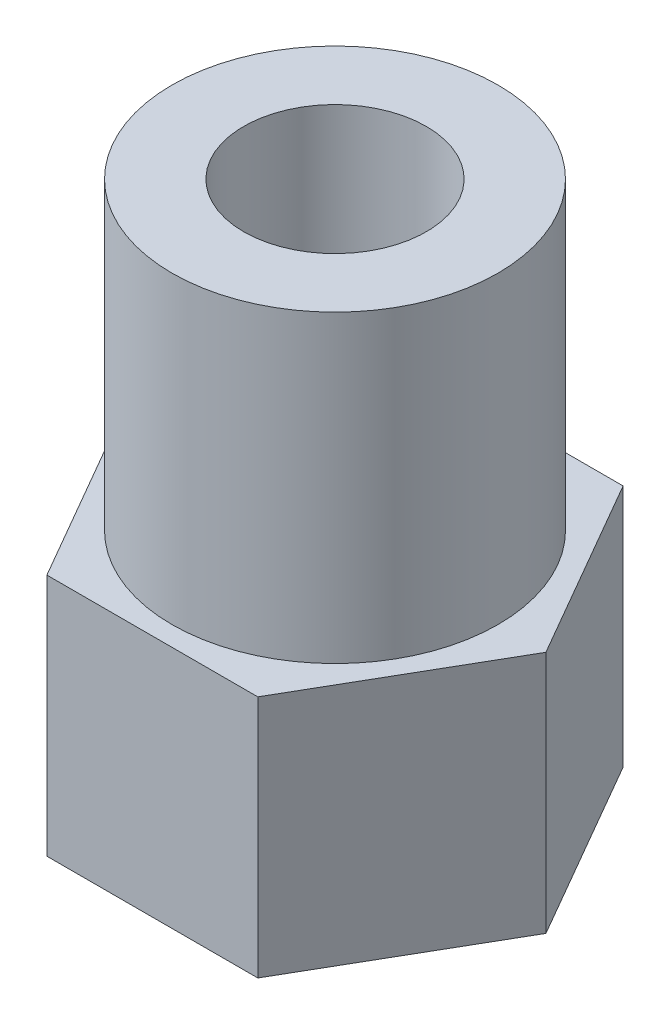
ISO-10303-21;
HEADER;
FILE_DESCRIPTION(('STEP AP214'),'2;1');
FILE_NAME('part.step','',(''),(''),'','','');
FILE_SCHEMA(('AUTOMOTIVE_DESIGN { 1 0 10303 214 1 1 1 1 }'));
ENDSEC;
DATA;
#1=APPLICATION_CONTEXT('core data for automotive mechanical design processes');
#2=APPLICATION_PROTOCOL_DEFINITION('international standard','automotive_design',2000,#1);
#3=PRODUCT_CONTEXT('',#1,'mechanical');
#4=PRODUCT('Part','Part','',(#3));
#5=PRODUCT_RELATED_PRODUCT_CATEGORY('part','',(#4));
#6=PRODUCT_DEFINITION_FORMATION('','',#4);
#7=PRODUCT_DEFINITION_CONTEXT('part definition',#1,'design');
#8=PRODUCT_DEFINITION('design','',#6,#7);
#9=PRODUCT_DEFINITION_SHAPE('','',#8);
#10=(LENGTH_UNIT() NAMED_UNIT(*) SI_UNIT(.MILLI.,.METRE.));
#11=(NAMED_UNIT(*) PLANE_ANGLE_UNIT() SI_UNIT($,.RADIAN.));
#12=(NAMED_UNIT(*) SI_UNIT($,.STERADIAN.) SOLID_ANGLE_UNIT());
#13=UNCERTAINTY_MEASURE_WITH_UNIT(LENGTH_MEASURE(1.E-05),#10,'distance_accuracy_value','');
#14=(GEOMETRIC_REPRESENTATION_CONTEXT(3) GLOBAL_UNCERTAINTY_ASSIGNED_CONTEXT((#13)) GLOBAL_UNIT_ASSIGNED_CONTEXT((#10,
#11,#12)) REPRESENTATION_CONTEXT('',''));
#15=CARTESIAN_POINT('',(0.,0.,0.));
#16=DIRECTION('',(0.,0.,1.));
#17=DIRECTION('',(1.,0.,0.));
#18=AXIS2_PLACEMENT_3D('',#15,#16,#17);
#19=CARTESIAN_POINT('',(6.93,8.,0.));
#20=DIRECTION('',(-0.866025403784439,0.,0.5));
#21=DIRECTION('',(0.5,0.,0.866025403784439));
#22=AXIS2_PLACEMENT_3D('',#19,#20,#21);
#23=PLANE('',#22);
#24=DIRECTION('',(-0.5,0.,-0.866025403784439));
#25=VECTOR('',#24,1.);
#26=CARTESIAN_POINT('',(6.93,0.,0.));
#27=LINE('',#26,#25);
#28=CARTESIAN_POINT('',(6.93,0.,0.));
#29=VERTEX_POINT('',#28);
#30=CARTESIAN_POINT('',(3.465,0.,-6.00155604822615));
#31=VERTEX_POINT('',#30);
#32=EDGE_CURVE('E130',#29,#31,#27,.T.);
#33=ORIENTED_EDGE('',*,*,#32,.T.);
#34=DIRECTION('',(0.,-1.,0.));
#35=VECTOR('',#34,1.);
#36=CARTESIAN_POINT('',(3.465,8.,-6.00155604822615));
#37=LINE('',#36,#35);
#38=CARTESIAN_POINT('',(3.465,8.,-6.00155604822615));
#39=VERTEX_POINT('',#38);
#40=EDGE_CURVE('E42',#39,#31,#37,.T.);
#41=ORIENTED_EDGE('',*,*,#40,.F.);
#42=DIRECTION('',(-0.5,0.,-0.866025403784439));
#43=VECTOR('',#42,1.);
#44=CARTESIAN_POINT('',(6.93,8.,0.));
#45=LINE('',#44,#43);
#46=CARTESIAN_POINT('',(6.93,8.,0.));
#47=VERTEX_POINT('',#46);
#48=EDGE_CURVE('E147',#47,#39,#45,.T.);
#49=ORIENTED_EDGE('',*,*,#48,.F.);
#50=DIRECTION('',(0.,-1.,0.));
#51=VECTOR('',#50,1.);
#52=CARTESIAN_POINT('',(6.93,8.,0.));
#53=LINE('',#52,#51);
#54=EDGE_CURVE('E126',#47,#29,#53,.T.);
#55=ORIENTED_EDGE('',*,*,#54,.T.);
#56=EDGE_LOOP('',(#33,#41,#49,#55));
#57=FACE_BOUND('',#56,.T.);
#58=ADVANCED_FACE('F39',(#57),#23,.F.);
#59=CARTESIAN_POINT('',(3.465,8.,-6.00155604822615));
#60=DIRECTION('',(0.,0.,1.));
#61=DIRECTION('',(1.,0.,0.));
#62=AXIS2_PLACEMENT_3D('',#59,#60,#61);
#63=PLANE('',#62);
#64=DIRECTION('',(-1.,0.,0.));
#65=VECTOR('',#64,1.);
#66=CARTESIAN_POINT('',(3.465,0.,-6.00155604822615));
#67=LINE('',#66,#65);
#68=CARTESIAN_POINT('',(-3.465,0.,-6.00155604822616));
#69=VERTEX_POINT('',#68);
#70=EDGE_CURVE('E134',#31,#69,#67,.T.);
#71=ORIENTED_EDGE('',*,*,#70,.T.);
#72=DIRECTION('',(0.,-1.,0.));
#73=VECTOR('',#72,1.);
#74=CARTESIAN_POINT('',(-3.465,8.,-6.00155604822616));
#75=LINE('',#74,#73);
#76=CARTESIAN_POINT('',(-3.465,8.,-6.00155604822616));
#77=VERTEX_POINT('',#76);
#78=EDGE_CURVE('E153',#77,#69,#75,.T.);
#79=ORIENTED_EDGE('',*,*,#78,.F.);
#80=DIRECTION('',(-1.,0.,0.));
#81=VECTOR('',#80,1.);
#82=CARTESIAN_POINT('',(3.465,8.,-6.00155604822615));
#83=LINE('',#82,#81);
#84=EDGE_CURVE('E95',#39,#77,#83,.T.);
#85=ORIENTED_EDGE('',*,*,#84,.F.);
#86=ORIENTED_EDGE('',*,*,#40,.T.);
#87=EDGE_LOOP('',(#71,#79,#85,#86));
#88=FACE_BOUND('',#87,.T.);
#89=ADVANCED_FACE('F160',(#88),#63,.F.);
#90=CARTESIAN_POINT('',(-3.465,8.,-6.00155604822616));
#91=DIRECTION('',(0.866025403784439,0.,0.5));
#92=DIRECTION('',(0.5,0.,-0.866025403784439));
#93=AXIS2_PLACEMENT_3D('',#90,#91,#92);
#94=PLANE('',#93);
#95=DIRECTION('',(-0.5,0.,0.866025403784439));
#96=VECTOR('',#95,1.);
#97=CARTESIAN_POINT('',(-3.465,0.,-6.00155604822616));
#98=LINE('',#97,#96);
#99=CARTESIAN_POINT('',(-6.93,0.,0.));
#100=VERTEX_POINT('',#99);
#101=EDGE_CURVE('E138',#69,#100,#98,.T.);
#102=ORIENTED_EDGE('',*,*,#101,.T.);
#103=DIRECTION('',(0.,-1.,0.));
#104=VECTOR('',#103,1.);
#105=CARTESIAN_POINT('',(-6.93,8.,0.));
#106=LINE('',#105,#104);
#107=CARTESIAN_POINT('',(-6.93,8.,0.));
#108=VERTEX_POINT('',#107);
#109=EDGE_CURVE('E119',#108,#100,#106,.T.);
#110=ORIENTED_EDGE('',*,*,#109,.F.);
#111=DIRECTION('',(-0.5,0.,0.866025403784439));
#112=VECTOR('',#111,1.);
#113=CARTESIAN_POINT('',(-3.465,8.,-6.00155604822616));
#114=LINE('',#113,#112);
#115=EDGE_CURVE('E108',#77,#108,#114,.T.);
#116=ORIENTED_EDGE('',*,*,#115,.F.);
#117=ORIENTED_EDGE('',*,*,#78,.T.);
#118=EDGE_LOOP('',(#102,#110,#116,#117));
#119=FACE_BOUND('',#118,.T.);
#120=ADVANCED_FACE('F166',(#119),#94,.F.);
#121=CARTESIAN_POINT('',(-6.93,8.,0.));
#122=DIRECTION('',(0.866025403784439,0.,-0.5));
#123=DIRECTION('',(-0.5,0.,-0.866025403784439));
#124=AXIS2_PLACEMENT_3D('',#121,#122,#123);
#125=PLANE('',#124);
#126=DIRECTION('',(0.5,0.,0.866025403784439));
#127=VECTOR('',#126,1.);
#128=CARTESIAN_POINT('',(-6.93,0.,0.));
#129=LINE('',#128,#127);
#130=CARTESIAN_POINT('',(-3.465,0.,6.00155604822616));
#131=VERTEX_POINT('',#130);
#132=EDGE_CURVE('E117',#100,#131,#129,.T.);
#133=ORIENTED_EDGE('',*,*,#132,.T.);
#134=DIRECTION('',(0.,-1.,0.));
#135=VECTOR('',#134,1.);
#136=CARTESIAN_POINT('',(-3.465,8.,6.00155604822616));
#137=LINE('',#136,#135);
#138=CARTESIAN_POINT('',(-3.465,8.,6.00155604822616));
#139=VERTEX_POINT('',#138);
#140=EDGE_CURVE('E114',#139,#131,#137,.T.);
#141=ORIENTED_EDGE('',*,*,#140,.F.);
#142=DIRECTION('',(0.5,0.,0.866025403784439));
#143=VECTOR('',#142,1.);
#144=CARTESIAN_POINT('',(-6.93,8.,0.));
#145=LINE('',#144,#143);
#146=EDGE_CURVE('E102',#108,#139,#145,.T.);
#147=ORIENTED_EDGE('',*,*,#146,.F.);
#148=ORIENTED_EDGE('',*,*,#109,.T.);
#149=EDGE_LOOP('',(#133,#141,#147,#148));
#150=FACE_BOUND('',#149,.T.);
#151=ADVANCED_FACE('F115',(#150),#125,.F.);
#152=CARTESIAN_POINT('',(-3.465,8.,6.00155604822616));
#153=DIRECTION('',(0.,0.,-1.));
#154=DIRECTION('',(-1.,0.,0.));
#155=AXIS2_PLACEMENT_3D('',#152,#153,#154);
#156=PLANE('',#155);
#157=DIRECTION('',(1.,0.,0.));
#158=VECTOR('',#157,1.);
#159=CARTESIAN_POINT('',(-3.465,0.,6.00155604822616));
#160=LINE('',#159,#158);
#161=CARTESIAN_POINT('',(3.465,0.,6.00155604822616));
#162=VERTEX_POINT('',#161);
#163=EDGE_CURVE('E80',#131,#162,#160,.T.);
#164=ORIENTED_EDGE('',*,*,#163,.T.);
#165=DIRECTION('',(0.,-1.,0.));
#166=VECTOR('',#165,1.);
#167=CARTESIAN_POINT('',(3.465,8.,6.00155604822616));
#168=LINE('',#167,#166);
#169=CARTESIAN_POINT('',(3.465,8.,6.00155604822616));
#170=VERTEX_POINT('',#169);
#171=EDGE_CURVE('E120',#170,#162,#168,.T.);
#172=ORIENTED_EDGE('',*,*,#171,.F.);
#173=DIRECTION('',(1.,0.,0.));
#174=VECTOR('',#173,1.);
#175=CARTESIAN_POINT('',(-3.465,8.,6.00155604822616));
#176=LINE('',#175,#174);
#177=EDGE_CURVE('E106',#139,#170,#176,.T.);
#178=ORIENTED_EDGE('',*,*,#177,.F.);
#179=ORIENTED_EDGE('',*,*,#140,.T.);
#180=EDGE_LOOP('',(#164,#172,#178,#179));
#181=FACE_BOUND('',#180,.T.);
#182=ADVANCED_FACE('F122',(#181),#156,.F.);
#183=CARTESIAN_POINT('',(3.465,8.,6.00155604822616));
#184=DIRECTION('',(-0.866025403784439,0.,-0.5));
#185=DIRECTION('',(-0.5,0.,0.866025403784439));
#186=AXIS2_PLACEMENT_3D('',#183,#184,#185);
#187=PLANE('',#186);
#188=DIRECTION('',(0.5,0.,-0.866025403784438));
#189=VECTOR('',#188,1.);
#190=CARTESIAN_POINT('',(3.465,0.,6.00155604822616));
#191=LINE('',#190,#189);
#192=EDGE_CURVE('E86',#162,#29,#191,.T.);
#193=ORIENTED_EDGE('',*,*,#192,.T.);
#194=ORIENTED_EDGE('',*,*,#54,.F.);
#195=DIRECTION('',(0.5,0.,-0.866025403784438));
#196=VECTOR('',#195,1.);
#197=CARTESIAN_POINT('',(3.465,8.,6.00155604822616));
#198=LINE('',#197,#196);
#199=EDGE_CURVE('E57',#170,#47,#198,.T.);
#200=ORIENTED_EDGE('',*,*,#199,.F.);
#201=ORIENTED_EDGE('',*,*,#171,.T.);
#202=EDGE_LOOP('',(#193,#194,#200,#201));
#203=FACE_BOUND('',#202,.T.);
#204=ADVANCED_FACE('F201',(#203),#187,.F.);
#205=CARTESIAN_POINT('',(0.,8.,0.));
#206=DIRECTION('',(0.,1.,0.));
#207=DIRECTION('',(0.,0.,1.));
#208=AXIS2_PLACEMENT_3D('',#205,#206,#207);
#209=PLANE('',#208);
#210=CARTESIAN_POINT('',(0.,8.,0.));
#211=DIRECTION('',(0.,1.,0.));
#212=DIRECTION('',(0.,0.,1.));
#213=AXIS2_PLACEMENT_3D('',#210,#211,#212);
#214=CIRCLE('',#213,5.35520643452161);
#215=CARTESIAN_POINT('',(0.,8.,5.35520643452161));
#216=VERTEX_POINT('',#215);
#217=EDGE_CURVE('E11',#216,#216,#214,.T.);
#218=ORIENTED_EDGE('',*,*,#217,.F.);
#219=EDGE_LOOP('',(#218));
#220=FACE_BOUND('',#219,.T.);
#221=ORIENTED_EDGE('',*,*,#48,.T.);
#222=ORIENTED_EDGE('',*,*,#84,.T.);
#223=ORIENTED_EDGE('',*,*,#115,.T.);
#224=ORIENTED_EDGE('',*,*,#146,.T.);
#225=ORIENTED_EDGE('',*,*,#177,.T.);
#226=ORIENTED_EDGE('',*,*,#199,.T.);
#227=EDGE_LOOP('',(#221,#222,#223,#224,#225,#226));
#228=FACE_BOUND('',#227,.T.);
#229=ADVANCED_FACE('F104',(#220,#228),#209,.T.);
#230=CARTESIAN_POINT('',(0.,0.,0.));
#231=DIRECTION('',(0.,1.,0.));
#232=DIRECTION('',(0.,0.,1.));
#233=AXIS2_PLACEMENT_3D('',#230,#231,#232);
#234=PLANE('',#233);
#235=CARTESIAN_POINT('',(0.,0.,0.));
#236=DIRECTION('',(0.,1.,0.));
#237=DIRECTION('',(0.,0.,1.));
#238=AXIS2_PLACEMENT_3D('',#235,#236,#237);
#239=CIRCLE('',#238,3.);
#240=CARTESIAN_POINT('',(0.,0.,3.));
#241=VERTEX_POINT('',#240);
#242=EDGE_CURVE('E176',#241,#241,#239,.T.);
#243=ORIENTED_EDGE('',*,*,#242,.T.);
#244=EDGE_LOOP('',(#243));
#245=FACE_BOUND('',#244,.T.);
#246=ORIENTED_EDGE('',*,*,#32,.F.);
#247=ORIENTED_EDGE('',*,*,#192,.F.);
#248=ORIENTED_EDGE('',*,*,#163,.F.);
#249=ORIENTED_EDGE('',*,*,#132,.F.);
#250=ORIENTED_EDGE('',*,*,#101,.F.);
#251=ORIENTED_EDGE('',*,*,#70,.F.);
#252=EDGE_LOOP('',(#246,#247,#248,#249,#250,#251));
#253=FACE_BOUND('',#252,.T.);
#254=ADVANCED_FACE('F165',(#245,#253),#234,.F.);
#255=CARTESIAN_POINT('',(0.,18.,0.));
#256=DIRECTION('',(0.,-1.,0.));
#257=DIRECTION('',(0.,0.,-1.));
#258=AXIS2_PLACEMENT_3D('',#255,#256,#257);
#259=CYLINDRICAL_SURFACE('',#258,5.35520643452161);
#260=CARTESIAN_POINT('',(0.,18.,0.));
#261=DIRECTION('',(0.,1.,0.));
#262=DIRECTION('',(0.,0.,1.));
#263=AXIS2_PLACEMENT_3D('',#260,#261,#262);
#264=CIRCLE('',#263,5.35520643452161);
#265=CARTESIAN_POINT('',(0.,18.,5.35520643452161));
#266=VERTEX_POINT('',#265);
#267=EDGE_CURVE('E135',#266,#266,#264,.T.);
#268=ORIENTED_EDGE('',*,*,#267,.F.);
#269=EDGE_LOOP('',(#268));
#270=FACE_BOUND('',#269,.T.);
#271=ORIENTED_EDGE('',*,*,#217,.T.);
#272=EDGE_LOOP('',(#271));
#273=FACE_BOUND('',#272,.T.);
#274=ADVANCED_FACE('F191',(#270,#273),#259,.T.);
#275=CARTESIAN_POINT('',(0.,18.,0.));
#276=DIRECTION('',(0.,1.,0.));
#277=DIRECTION('',(0.,0.,1.));
#278=AXIS2_PLACEMENT_3D('',#275,#276,#277);
#279=PLANE('',#278);
#280=CARTESIAN_POINT('',(0.,18.,0.));
#281=DIRECTION('',(0.,1.,0.));
#282=DIRECTION('',(0.,0.,1.));
#283=AXIS2_PLACEMENT_3D('',#280,#281,#282);
#284=CIRCLE('',#283,3.);
#285=CARTESIAN_POINT('',(0.,18.,3.));
#286=VERTEX_POINT('',#285);
#287=EDGE_CURVE('E180',#286,#286,#284,.T.);
#288=ORIENTED_EDGE('',*,*,#287,.F.);
#289=EDGE_LOOP('',(#288));
#290=FACE_BOUND('',#289,.T.);
#291=ORIENTED_EDGE('',*,*,#267,.T.);
#292=EDGE_LOOP('',(#291));
#293=FACE_BOUND('',#292,.T.);
#294=ADVANCED_FACE('F188',(#290,#293),#279,.T.);
#295=CARTESIAN_POINT('',(0.,-2.,0.));
#296=DIRECTION('',(0.,1.,0.));
#297=DIRECTION('',(0.,0.,1.));
#298=AXIS2_PLACEMENT_3D('',#295,#296,#297);
#299=CYLINDRICAL_SURFACE('',#298,3.);
#300=ORIENTED_EDGE('',*,*,#287,.T.);
#301=EDGE_LOOP('',(#300));
#302=FACE_BOUND('',#301,.T.);
#303=ORIENTED_EDGE('',*,*,#242,.F.);
#304=EDGE_LOOP('',(#303));
#305=FACE_BOUND('',#304,.T.);
#306=ADVANCED_FACE('F185',(#302,#305),#299,.F.);
#307=CLOSED_SHELL('',(#58,#89,#120,#151,#182,#204,#229,#254,#274,#294,#306));
#308=MANIFOLD_SOLID_BREP('B2',#307);
#309=ADVANCED_BREP_SHAPE_REPRESENTATION('',(#18,#308),#14);
#310=SHAPE_DEFINITION_REPRESENTATION(#9,#309);
ENDSEC;
END-ISO-10303-21;
